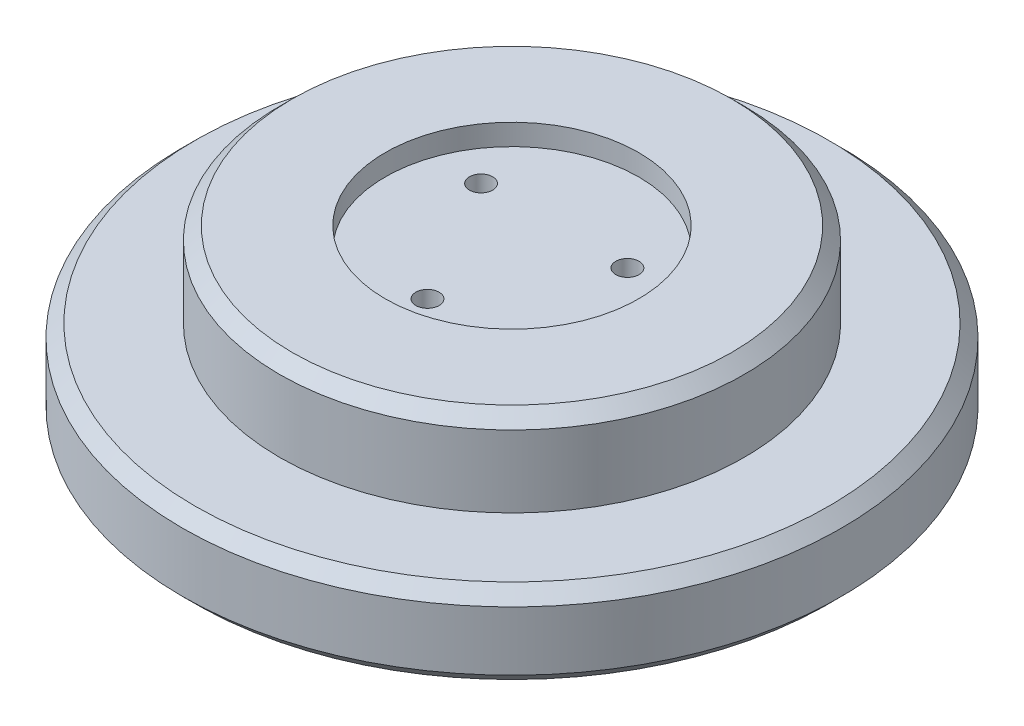
ISO-10303-21;
HEADER;
FILE_DESCRIPTION(('STEP AP214'),'2;1');
FILE_NAME('part.step','',(''),(''),'','','');
FILE_SCHEMA(('AUTOMOTIVE_DESIGN { 1 0 10303 214 1 1 1 1 }'));
ENDSEC;
DATA;
#1=APPLICATION_CONTEXT('core data for automotive mechanical design processes');
#2=APPLICATION_PROTOCOL_DEFINITION('international standard','automotive_design',2000,#1);
#3=PRODUCT_CONTEXT('',#1,'mechanical');
#4=PRODUCT('Part','Part','',(#3));
#5=PRODUCT_RELATED_PRODUCT_CATEGORY('part','',(#4));
#6=PRODUCT_DEFINITION_FORMATION('','',#4);
#7=PRODUCT_DEFINITION_CONTEXT('part definition',#1,'design');
#8=PRODUCT_DEFINITION('design','',#6,#7);
#9=PRODUCT_DEFINITION_SHAPE('','',#8);
#10=(LENGTH_UNIT() NAMED_UNIT(*) SI_UNIT(.MILLI.,.METRE.));
#11=(NAMED_UNIT(*) PLANE_ANGLE_UNIT() SI_UNIT($,.RADIAN.));
#12=(NAMED_UNIT(*) SI_UNIT($,.STERADIAN.) SOLID_ANGLE_UNIT());
#13=UNCERTAINTY_MEASURE_WITH_UNIT(LENGTH_MEASURE(1.E-05),#10,'distance_accuracy_value','');
#14=(GEOMETRIC_REPRESENTATION_CONTEXT(3) GLOBAL_UNCERTAINTY_ASSIGNED_CONTEXT((#13)) GLOBAL_UNIT_ASSIGNED_CONTEXT((#10,
#11,#12)) REPRESENTATION_CONTEXT('',''));
#15=CARTESIAN_POINT('',(0.,0.,0.));
#16=DIRECTION('',(0.,0.,1.));
#17=DIRECTION('',(1.,0.,0.));
#18=AXIS2_PLACEMENT_3D('',#15,#16,#17);
#19=CARTESIAN_POINT('',(0.,0.,20.));
#20=DIRECTION('',(0.,-1.,0.));
#21=DIRECTION('',(0.,0.,-1.));
#22=AXIS2_PLACEMENT_3D('',#19,#20,#21);
#23=CYLINDRICAL_SURFACE('',#22,2.74999999999999);
#24=CARTESIAN_POINT('',(0.,35.,20.));
#25=DIRECTION('',(0.,1.,0.));
#26=DIRECTION('',(0.,0.,1.));
#27=AXIS2_PLACEMENT_3D('',#24,#25,#26);
#28=CIRCLE('',#27,2.74999999999999);
#29=CARTESIAN_POINT('',(0.,35.,22.75));
#30=VERTEX_POINT('',#29);
#31=EDGE_CURVE('E72',#30,#30,#28,.T.);
#32=ORIENTED_EDGE('',*,*,#31,.T.);
#33=EDGE_LOOP('',(#32));
#34=FACE_BOUND('',#33,.T.);
#35=CARTESIAN_POINT('',(0.,5.,20.));
#36=DIRECTION('',(0.,-1.,0.));
#37=DIRECTION('',(0.,0.,-1.));
#38=AXIS2_PLACEMENT_3D('',#35,#36,#37);
#39=CIRCLE('',#38,2.74999999999999);
#40=CARTESIAN_POINT('',(0.,5.,17.25));
#41=VERTEX_POINT('',#40);
#42=EDGE_CURVE('E42',#41,#41,#39,.F.);
#43=ORIENTED_EDGE('',*,*,#42,.F.);
#44=EDGE_LOOP('',(#43));
#45=FACE_BOUND('',#44,.T.);
#46=ADVANCED_FACE('F37',(#34,#45),#23,.F.);
#47=CARTESIAN_POINT('',(17.3205080756887,0.,-10.0000000000001));
#48=DIRECTION('',(0.,-1.,0.));
#49=DIRECTION('',(0.,0.,-1.));
#50=AXIS2_PLACEMENT_3D('',#47,#48,#49);
#51=CYLINDRICAL_SURFACE('',#50,2.74999999999999);
#52=CARTESIAN_POINT('',(17.3205080756887,35.,-10.0000000000001));
#53=DIRECTION('',(0.,1.,0.));
#54=DIRECTION('',(0.,0.,1.));
#55=AXIS2_PLACEMENT_3D('',#52,#53,#54);
#56=CIRCLE('',#55,2.74999999999999);
#57=CARTESIAN_POINT('',(17.3205080756887,35.,-7.25000000000009));
#58=VERTEX_POINT('',#57);
#59=EDGE_CURVE('E67',#58,#58,#56,.T.);
#60=ORIENTED_EDGE('',*,*,#59,.T.);
#61=EDGE_LOOP('',(#60));
#62=FACE_BOUND('',#61,.T.);
#63=CARTESIAN_POINT('',(17.3205080756887,5.,-10.0000000000001));
#64=DIRECTION('',(0.,-1.,0.));
#65=DIRECTION('',(0.,0.,-1.));
#66=AXIS2_PLACEMENT_3D('',#63,#64,#65);
#67=CIRCLE('',#66,2.74999999999999);
#68=CARTESIAN_POINT('',(17.3205080756887,5.,-12.7500000000001));
#69=VERTEX_POINT('',#68);
#70=EDGE_CURVE('E57',#69,#69,#67,.F.);
#71=ORIENTED_EDGE('',*,*,#70,.F.);
#72=EDGE_LOOP('',(#71));
#73=FACE_BOUND('',#72,.T.);
#74=ADVANCED_FACE('F107',(#62,#73),#51,.F.);
#75=CARTESIAN_POINT('',(-17.3205080756889,0.,-9.99999999999984));
#76=DIRECTION('',(0.,-1.,0.));
#77=DIRECTION('',(0.,0.,-1.));
#78=AXIS2_PLACEMENT_3D('',#75,#76,#77);
#79=CYLINDRICAL_SURFACE('',#78,2.74999999999999);
#80=CARTESIAN_POINT('',(-17.3205080756889,35.,-9.99999999999984));
#81=DIRECTION('',(0.,1.,0.));
#82=DIRECTION('',(0.,0.,1.));
#83=AXIS2_PLACEMENT_3D('',#80,#81,#82);
#84=CIRCLE('',#83,2.74999999999999);
#85=CARTESIAN_POINT('',(-17.3205080756889,35.,-7.24999999999985));
#86=VERTEX_POINT('',#85);
#87=EDGE_CURVE('E63',#86,#86,#84,.T.);
#88=ORIENTED_EDGE('',*,*,#87,.T.);
#89=EDGE_LOOP('',(#88));
#90=FACE_BOUND('',#89,.T.);
#91=CARTESIAN_POINT('',(-17.3205080756889,5.,-9.99999999999984));
#92=DIRECTION('',(0.,-1.,0.));
#93=DIRECTION('',(0.,0.,-1.));
#94=AXIS2_PLACEMENT_3D('',#91,#92,#93);
#95=CIRCLE('',#94,2.74999999999999);
#96=CARTESIAN_POINT('',(-17.3205080756889,5.,-12.7499999999998));
#97=VERTEX_POINT('',#96);
#98=EDGE_CURVE('E55',#97,#97,#95,.F.);
#99=ORIENTED_EDGE('',*,*,#98,.F.);
#100=EDGE_LOOP('',(#99));
#101=FACE_BOUND('',#100,.T.);
#102=ADVANCED_FACE('F113',(#90,#101),#79,.F.);
#103=CARTESIAN_POINT('',(0.,0.,0.));
#104=DIRECTION('',(0.,-1.,0.));
#105=DIRECTION('',(0.,0.,-1.));
#106=AXIS2_PLACEMENT_3D('',#103,#104,#105);
#107=PLANE('',#106);
#108=CARTESIAN_POINT('',(0.,0.,20.));
#109=DIRECTION('',(0.,-1.,0.));
#110=DIRECTION('',(0.,0.,-1.));
#111=AXIS2_PLACEMENT_3D('',#108,#109,#110);
#112=CIRCLE('',#111,5.);
#113=CARTESIAN_POINT('',(0.,0.,15.));
#114=VERTEX_POINT('',#113);
#115=EDGE_CURVE('E156',#114,#114,#112,.T.);
#116=ORIENTED_EDGE('',*,*,#115,.F.);
#117=EDGE_LOOP('',(#116));
#118=FACE_BOUND('',#117,.T.);
#119=CARTESIAN_POINT('',(17.3205080756901,0.,-9.99999999999926));
#120=DIRECTION('',(0.,-1.,0.));
#121=DIRECTION('',(0.,0.,-1.));
#122=AXIS2_PLACEMENT_3D('',#119,#120,#121);
#123=CIRCLE('',#122,5.0000000000011);
#124=CARTESIAN_POINT('',(17.3205080756901,0.,-15.0000000000004));
#125=VERTEX_POINT('',#124);
#126=EDGE_CURVE('E160',#125,#125,#123,.T.);
#127=ORIENTED_EDGE('',*,*,#126,.F.);
#128=EDGE_LOOP('',(#127));
#129=FACE_BOUND('',#128,.T.);
#130=CARTESIAN_POINT('',(-17.3205080756875,0.,-10.0000000000007));
#131=DIRECTION('',(0.,-1.,0.));
#132=DIRECTION('',(0.,0.,-1.));
#133=AXIS2_PLACEMENT_3D('',#130,#131,#132);
#134=CIRCLE('',#133,5.00000000000161);
#135=CARTESIAN_POINT('',(-17.3205080756875,0.,-15.0000000000024));
#136=VERTEX_POINT('',#135);
#137=EDGE_CURVE('E164',#136,#136,#134,.T.);
#138=ORIENTED_EDGE('',*,*,#137,.F.);
#139=EDGE_LOOP('',(#138));
#140=FACE_BOUND('',#139,.T.);
#141=CARTESIAN_POINT('',(0.,0.,0.));
#142=DIRECTION('',(0.,-1.,0.));
#143=DIRECTION('',(0.,0.,-1.));
#144=AXIS2_PLACEMENT_3D('',#141,#142,#143);
#145=CIRCLE('',#144,75.);
#146=CARTESIAN_POINT('',(0.,0.,-75.));
#147=VERTEX_POINT('',#146);
#148=EDGE_CURVE('E83',#147,#147,#145,.T.);
#149=ORIENTED_EDGE('',*,*,#148,.T.);
#150=EDGE_LOOP('',(#149));
#151=FACE_BOUND('',#150,.T.);
#152=ADVANCED_FACE('F139',(#118,#129,#140,#151),#107,.T.);
#153=CARTESIAN_POINT('',(0.,226.15440200808,0.));
#154=DIRECTION('',(0.,1.,0.));
#155=DIRECTION('',(0.,0.,1.));
#156=AXIS2_PLACEMENT_3D('',#153,#154,#155);
#157=CYLINDRICAL_SURFACE('',#156,78.);
#158=CARTESIAN_POINT('',(0.,3.00000000000003,0.));
#159=DIRECTION('',(0.,-1.,0.));
#160=DIRECTION('',(0.,0.,-1.));
#161=AXIS2_PLACEMENT_3D('',#158,#159,#160);
#162=CIRCLE('',#161,78.);
#163=CARTESIAN_POINT('',(0.,3.00000000000003,-78.));
#164=VERTEX_POINT('',#163);
#165=EDGE_CURVE('E79',#164,#164,#162,.F.);
#166=ORIENTED_EDGE('',*,*,#165,.T.);
#167=EDGE_LOOP('',(#166));
#168=FACE_BOUND('',#167,.T.);
#169=CARTESIAN_POINT('',(0.,16.9999999999999,0.));
#170=DIRECTION('',(0.,1.,0.));
#171=DIRECTION('',(0.,0.,1.));
#172=AXIS2_PLACEMENT_3D('',#169,#170,#171);
#173=CIRCLE('',#172,78.);
#174=CARTESIAN_POINT('',(0.,16.9999999999999,78.));
#175=VERTEX_POINT('',#174);
#176=EDGE_CURVE('E76',#175,#175,#173,.F.);
#177=ORIENTED_EDGE('',*,*,#176,.T.);
#178=EDGE_LOOP('',(#177));
#179=FACE_BOUND('',#178,.T.);
#180=ADVANCED_FACE('F136',(#168,#179),#157,.T.);
#181=CARTESIAN_POINT('',(0.,20.,78.));
#182=DIRECTION('',(0.,1.,0.));
#183=DIRECTION('',(0.,0.,1.));
#184=AXIS2_PLACEMENT_3D('',#181,#182,#183);
#185=PLANE('',#184);
#186=CARTESIAN_POINT('',(0.,20.,0.));
#187=DIRECTION('',(0.,1.,0.));
#188=DIRECTION('',(0.,0.,1.));
#189=AXIS2_PLACEMENT_3D('',#186,#187,#188);
#190=CIRCLE('',#189,75.);
#191=CARTESIAN_POINT('',(0.,20.,75.));
#192=VERTEX_POINT('',#191);
#193=EDGE_CURVE('E51',#192,#192,#190,.T.);
#194=ORIENTED_EDGE('',*,*,#193,.T.);
#195=EDGE_LOOP('',(#194));
#196=FACE_BOUND('',#195,.T.);
#197=CARTESIAN_POINT('',(0.,20.,0.));
#198=DIRECTION('',(0.,1.,0.));
#199=DIRECTION('',(0.,0.,1.));
#200=AXIS2_PLACEMENT_3D('',#197,#198,#199);
#201=CIRCLE('',#200,55.);
#202=CARTESIAN_POINT('',(0.,20.,55.));
#203=VERTEX_POINT('',#202);
#204=EDGE_CURVE('E80',#203,#203,#201,.T.);
#205=ORIENTED_EDGE('',*,*,#204,.F.);
#206=EDGE_LOOP('',(#205));
#207=FACE_BOUND('',#206,.T.);
#208=ADVANCED_FACE('F88',(#196,#207),#185,.T.);
#209=CARTESIAN_POINT('',(0.,226.15440200808,0.));
#210=DIRECTION('',(0.,1.,0.));
#211=DIRECTION('',(0.,0.,1.));
#212=AXIS2_PLACEMENT_3D('',#209,#210,#211);
#213=CYLINDRICAL_SURFACE('',#212,55.);
#214=CARTESIAN_POINT('',(0.,37.,0.));
#215=DIRECTION('',(0.,1.,0.));
#216=DIRECTION('',(0.,0.,1.));
#217=AXIS2_PLACEMENT_3D('',#214,#215,#216);
#218=CIRCLE('',#217,55.);
#219=CARTESIAN_POINT('',(0.,37.,55.));
#220=VERTEX_POINT('',#219);
#221=EDGE_CURVE('E10',#220,#220,#218,.F.);
#222=ORIENTED_EDGE('',*,*,#221,.T.);
#223=EDGE_LOOP('',(#222));
#224=FACE_BOUND('',#223,.T.);
#225=ORIENTED_EDGE('',*,*,#204,.T.);
#226=EDGE_LOOP('',(#225));
#227=FACE_BOUND('',#226,.T.);
#228=ADVANCED_FACE('F130',(#224,#227),#213,.T.);
#229=CARTESIAN_POINT('',(0.,40.,55.));
#230=DIRECTION('',(0.,1.,0.));
#231=DIRECTION('',(0.,0.,1.));
#232=AXIS2_PLACEMENT_3D('',#229,#230,#231);
#233=PLANE('',#232);
#234=CARTESIAN_POINT('',(0.,40.,0.));
#235=DIRECTION('',(0.,1.,0.));
#236=DIRECTION('',(0.,0.,1.));
#237=AXIS2_PLACEMENT_3D('',#234,#235,#236);
#238=CIRCLE('',#237,52.);
#239=CARTESIAN_POINT('',(0.,40.,52.));
#240=VERTEX_POINT('',#239);
#241=EDGE_CURVE('E46',#240,#240,#238,.T.);
#242=ORIENTED_EDGE('',*,*,#241,.T.);
#243=EDGE_LOOP('',(#242));
#244=FACE_BOUND('',#243,.T.);
#245=CARTESIAN_POINT('',(0.,40.,0.));
#246=DIRECTION('',(0.,1.,0.));
#247=DIRECTION('',(0.,0.,1.));
#248=AXIS2_PLACEMENT_3D('',#245,#246,#247);
#249=CIRCLE('',#248,30.);
#250=CARTESIAN_POINT('',(0.,40.,30.));
#251=VERTEX_POINT('',#250);
#252=EDGE_CURVE('E179',#251,#251,#249,.T.);
#253=ORIENTED_EDGE('',*,*,#252,.F.);
#254=EDGE_LOOP('',(#253));
#255=FACE_BOUND('',#254,.T.);
#256=ADVANCED_FACE('F126',(#244,#255),#233,.T.);
#257=CARTESIAN_POINT('',(0.,226.15440200808,0.));
#258=DIRECTION('',(0.,1.,0.));
#259=DIRECTION('',(0.,0.,1.));
#260=AXIS2_PLACEMENT_3D('',#257,#258,#259);
#261=CYLINDRICAL_SURFACE('',#260,30.);
#262=ORIENTED_EDGE('',*,*,#252,.T.);
#263=EDGE_LOOP('',(#262));
#264=FACE_BOUND('',#263,.T.);
#265=CARTESIAN_POINT('',(0.,35.,0.));
#266=DIRECTION('',(0.,1.,0.));
#267=DIRECTION('',(0.,0.,1.));
#268=AXIS2_PLACEMENT_3D('',#265,#266,#267);
#269=CIRCLE('',#268,30.);
#270=CARTESIAN_POINT('',(0.,35.,30.));
#271=VERTEX_POINT('',#270);
#272=EDGE_CURVE('E176',#271,#271,#269,.T.);
#273=ORIENTED_EDGE('',*,*,#272,.F.);
#274=EDGE_LOOP('',(#273));
#275=FACE_BOUND('',#274,.T.);
#276=ADVANCED_FACE('F122',(#264,#275),#261,.F.);
#277=CARTESIAN_POINT('',(0.,35.,30.));
#278=DIRECTION('',(0.,1.,0.));
#279=DIRECTION('',(0.,0.,1.));
#280=AXIS2_PLACEMENT_3D('',#277,#278,#279);
#281=PLANE('',#280);
#282=ORIENTED_EDGE('',*,*,#87,.F.);
#283=EDGE_LOOP('',(#282));
#284=FACE_BOUND('',#283,.T.);
#285=ORIENTED_EDGE('',*,*,#59,.F.);
#286=EDGE_LOOP('',(#285));
#287=FACE_BOUND('',#286,.T.);
#288=ORIENTED_EDGE('',*,*,#31,.F.);
#289=EDGE_LOOP('',(#288));
#290=FACE_BOUND('',#289,.T.);
#291=ORIENTED_EDGE('',*,*,#272,.T.);
#292=EDGE_LOOP('',(#291));
#293=FACE_BOUND('',#292,.T.);
#294=ADVANCED_FACE('F101',(#284,#287,#290,#293),#281,.T.);
#295=CARTESIAN_POINT('',(0.,3.00000000000003,0.));
#296=DIRECTION('',(0.,1.,0.));
#297=DIRECTION('',(0.,0.,1.));
#298=AXIS2_PLACEMENT_3D('',#295,#296,#297);
#299=CONICAL_SURFACE('',#298,78.,0.785398163397448);
#300=ORIENTED_EDGE('',*,*,#148,.F.);
#301=EDGE_LOOP('',(#300));
#302=FACE_BOUND('',#301,.T.);
#303=ORIENTED_EDGE('',*,*,#165,.F.);
#304=EDGE_LOOP('',(#303));
#305=FACE_BOUND('',#304,.T.);
#306=ADVANCED_FACE('F93',(#302,#305),#299,.T.);
#307=CARTESIAN_POINT('',(0.,20.,0.));
#308=DIRECTION('',(0.,-1.,0.));
#309=DIRECTION('',(0.,0.,-1.));
#310=AXIS2_PLACEMENT_3D('',#307,#308,#309);
#311=CONICAL_SURFACE('',#310,75.,0.785398163397446);
#312=ORIENTED_EDGE('',*,*,#176,.F.);
#313=EDGE_LOOP('',(#312));
#314=FACE_BOUND('',#313,.T.);
#315=ORIENTED_EDGE('',*,*,#193,.F.);
#316=EDGE_LOOP('',(#315));
#317=FACE_BOUND('',#316,.T.);
#318=ADVANCED_FACE('F91',(#314,#317),#311,.T.);
#319=CARTESIAN_POINT('',(0.,40.,0.));
#320=DIRECTION('',(0.,-1.,0.));
#321=DIRECTION('',(0.,0.,-1.));
#322=AXIS2_PLACEMENT_3D('',#319,#320,#321);
#323=CONICAL_SURFACE('',#322,52.,0.785398163397446);
#324=ORIENTED_EDGE('',*,*,#221,.F.);
#325=EDGE_LOOP('',(#324));
#326=FACE_BOUND('',#325,.T.);
#327=ORIENTED_EDGE('',*,*,#241,.F.);
#328=EDGE_LOOP('',(#327));
#329=FACE_BOUND('',#328,.T.);
#330=ADVANCED_FACE('F40',(#326,#329),#323,.T.);
#331=CARTESIAN_POINT('',(-17.3205080756875,5.,-10.0000000000007));
#332=DIRECTION('',(0.,-1.,0.));
#333=DIRECTION('',(0.,0.,-1.));
#334=AXIS2_PLACEMENT_3D('',#331,#332,#333);
#335=PLANE('',#334);
#336=CARTESIAN_POINT('',(-17.3205080756875,5.,-10.0000000000007));
#337=DIRECTION('',(0.,-1.,0.));
#338=DIRECTION('',(0.,0.,-1.));
#339=AXIS2_PLACEMENT_3D('',#336,#337,#338);
#340=CIRCLE('',#339,5.00000000000161);
#341=CARTESIAN_POINT('',(-17.3205080756875,5.,-15.0000000000024));
#342=VERTEX_POINT('',#341);
#343=EDGE_CURVE('E170',#342,#342,#340,.T.);
#344=ORIENTED_EDGE('',*,*,#343,.T.);
#345=EDGE_LOOP('',(#344));
#346=FACE_BOUND('',#345,.T.);
#347=ORIENTED_EDGE('',*,*,#98,.T.);
#348=EDGE_LOOP('',(#347));
#349=FACE_BOUND('',#348,.T.);
#350=ADVANCED_FACE('F99',(#346,#349),#335,.T.);
#351=CARTESIAN_POINT('',(-17.3205080756875,5.,-10.0000000000007));
#352=DIRECTION('',(0.,-1.,0.));
#353=DIRECTION('',(0.,0.,-1.));
#354=AXIS2_PLACEMENT_3D('',#351,#352,#353);
#355=CYLINDRICAL_SURFACE('',#354,5.00000000000161);
#356=ORIENTED_EDGE('',*,*,#343,.F.);
#357=EDGE_LOOP('',(#356));
#358=FACE_BOUND('',#357,.T.);
#359=ORIENTED_EDGE('',*,*,#137,.T.);
#360=EDGE_LOOP('',(#359));
#361=FACE_BOUND('',#360,.T.);
#362=ADVANCED_FACE('F215',(#358,#361),#355,.F.);
#363=CARTESIAN_POINT('',(17.3205080756901,5.,-9.99999999999926));
#364=DIRECTION('',(0.,-1.,0.));
#365=DIRECTION('',(0.,0.,-1.));
#366=AXIS2_PLACEMENT_3D('',#363,#364,#365);
#367=PLANE('',#366);
#368=CARTESIAN_POINT('',(17.3205080756901,5.,-9.99999999999926));
#369=DIRECTION('',(0.,-1.,0.));
#370=DIRECTION('',(0.,0.,-1.));
#371=AXIS2_PLACEMENT_3D('',#368,#369,#370);
#372=CIRCLE('',#371,5.0000000000011);
#373=CARTESIAN_POINT('',(17.3205080756901,5.,-15.0000000000004));
#374=VERTEX_POINT('',#373);
#375=EDGE_CURVE('E193',#374,#374,#372,.T.);
#376=ORIENTED_EDGE('',*,*,#375,.T.);
#377=EDGE_LOOP('',(#376));
#378=FACE_BOUND('',#377,.T.);
#379=ORIENTED_EDGE('',*,*,#70,.T.);
#380=EDGE_LOOP('',(#379));
#381=FACE_BOUND('',#380,.T.);
#382=ADVANCED_FACE('F212',(#378,#381),#367,.T.);
#383=CARTESIAN_POINT('',(17.3205080756901,5.,-9.99999999999926));
#384=DIRECTION('',(0.,-1.,0.));
#385=DIRECTION('',(0.,0.,-1.));
#386=AXIS2_PLACEMENT_3D('',#383,#384,#385);
#387=CYLINDRICAL_SURFACE('',#386,5.0000000000011);
#388=ORIENTED_EDGE('',*,*,#375,.F.);
#389=EDGE_LOOP('',(#388));
#390=FACE_BOUND('',#389,.T.);
#391=ORIENTED_EDGE('',*,*,#126,.T.);
#392=EDGE_LOOP('',(#391));
#393=FACE_BOUND('',#392,.T.);
#394=ADVANCED_FACE('F209',(#390,#393),#387,.F.);
#395=CARTESIAN_POINT('',(0.,5.,20.));
#396=DIRECTION('',(0.,-1.,0.));
#397=DIRECTION('',(0.,0.,-1.));
#398=AXIS2_PLACEMENT_3D('',#395,#396,#397);
#399=PLANE('',#398);
#400=CARTESIAN_POINT('',(0.,5.,20.));
#401=DIRECTION('',(0.,-1.,0.));
#402=DIRECTION('',(0.,0.,-1.));
#403=AXIS2_PLACEMENT_3D('',#400,#401,#402);
#404=CIRCLE('',#403,5.);
#405=CARTESIAN_POINT('',(0.,5.,15.));
#406=VERTEX_POINT('',#405);
#407=EDGE_CURVE('E58',#406,#406,#404,.T.);
#408=ORIENTED_EDGE('',*,*,#407,.T.);
#409=EDGE_LOOP('',(#408));
#410=FACE_BOUND('',#409,.T.);
#411=ORIENTED_EDGE('',*,*,#42,.T.);
#412=EDGE_LOOP('',(#411));
#413=FACE_BOUND('',#412,.T.);
#414=ADVANCED_FACE('F200',(#410,#413),#399,.T.);
#415=CARTESIAN_POINT('',(0.,5.,20.));
#416=DIRECTION('',(0.,-1.,0.));
#417=DIRECTION('',(0.,0.,-1.));
#418=AXIS2_PLACEMENT_3D('',#415,#416,#417);
#419=CYLINDRICAL_SURFACE('',#418,5.);
#420=ORIENTED_EDGE('',*,*,#407,.F.);
#421=EDGE_LOOP('',(#420));
#422=FACE_BOUND('',#421,.T.);
#423=ORIENTED_EDGE('',*,*,#115,.T.);
#424=EDGE_LOOP('',(#423));
#425=FACE_BOUND('',#424,.T.);
#426=ADVANCED_FACE('F202',(#422,#425),#419,.F.);
#427=CLOSED_SHELL('',(#46,#74,#102,#152,#180,#208,#228,#256,#276,#294,#306,#318,#330,#350,#362,
#382,#394,#414,#426));
#428=MANIFOLD_SOLID_BREP('B2',#427);
#429=ADVANCED_BREP_SHAPE_REPRESENTATION('',(#18,#428),#14);
#430=SHAPE_DEFINITION_REPRESENTATION(#9,#429);
ENDSEC;
END-ISO-10303-21;
